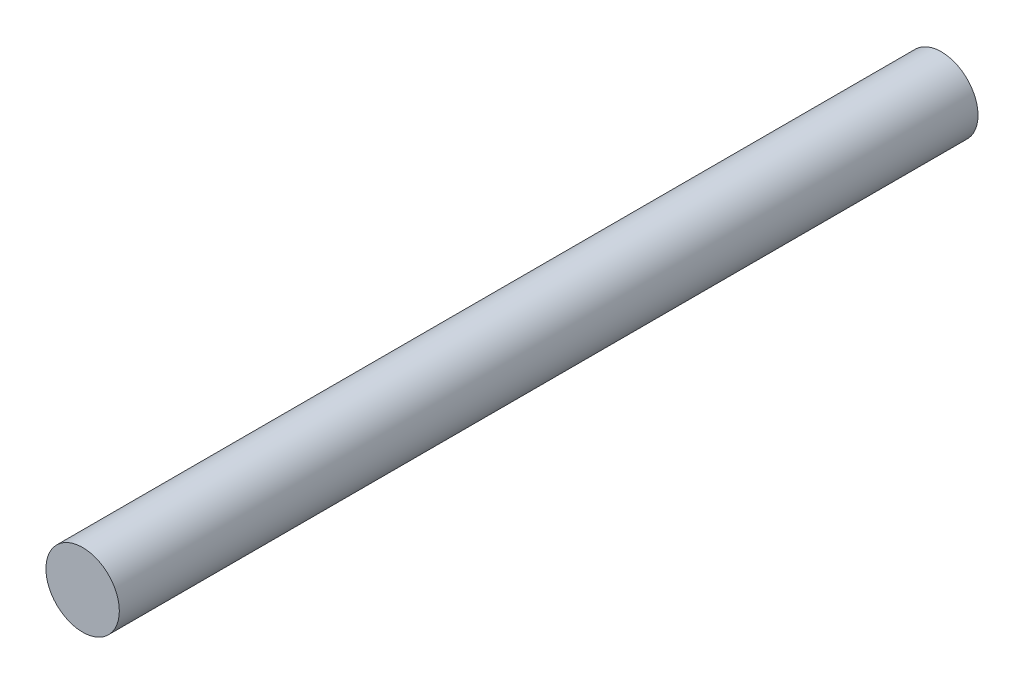
ISO-10303-21;
HEADER;
FILE_DESCRIPTION(('STEP AP214'),'2;1');
FILE_NAME('part.step','',(''),(''),'','','');
FILE_SCHEMA(('AUTOMOTIVE_DESIGN { 1 0 10303 214 1 1 1 1 }'));
ENDSEC;
DATA;
#1=APPLICATION_CONTEXT('core data for automotive mechanical design processes');
#2=APPLICATION_PROTOCOL_DEFINITION('international standard','automotive_design',2000,#1);
#3=PRODUCT_CONTEXT('',#1,'mechanical');
#4=PRODUCT('Part','Part','',(#3));
#5=PRODUCT_RELATED_PRODUCT_CATEGORY('part','',(#4));
#6=PRODUCT_DEFINITION_FORMATION('','',#4);
#7=PRODUCT_DEFINITION_CONTEXT('part definition',#1,'design');
#8=PRODUCT_DEFINITION('design','',#6,#7);
#9=PRODUCT_DEFINITION_SHAPE('','',#8);
#10=(LENGTH_UNIT() NAMED_UNIT(*) SI_UNIT(.MILLI.,.METRE.));
#11=(NAMED_UNIT(*) PLANE_ANGLE_UNIT() SI_UNIT($,.RADIAN.));
#12=(NAMED_UNIT(*) SI_UNIT($,.STERADIAN.) SOLID_ANGLE_UNIT());
#13=UNCERTAINTY_MEASURE_WITH_UNIT(LENGTH_MEASURE(1.E-05),#10,'distance_accuracy_value','');
#14=(GEOMETRIC_REPRESENTATION_CONTEXT(3) GLOBAL_UNCERTAINTY_ASSIGNED_CONTEXT((#13)) GLOBAL_UNIT_ASSIGNED_CONTEXT((#10,
#11,#12)) REPRESENTATION_CONTEXT('',''));
#15=CARTESIAN_POINT('',(0.,0.,0.));
#16=DIRECTION('',(0.,0.,1.));
#17=DIRECTION('',(1.,0.,0.));
#18=AXIS2_PLACEMENT_3D('',#15,#16,#17);
#19=CARTESIAN_POINT('',(0.,0.,46.8));
#20=DIRECTION('',(0.,0.,-1.));
#21=DIRECTION('',(-1.,0.,0.));
#22=AXIS2_PLACEMENT_3D('',#19,#20,#21);
#23=CYLINDRICAL_SURFACE('',#22,2.);
#24=CARTESIAN_POINT('',(0.,0.,46.8));
#25=DIRECTION('',(0.,0.,1.));
#26=DIRECTION('',(1.,0.,0.));
#27=AXIS2_PLACEMENT_3D('',#24,#25,#26);
#28=CIRCLE('',#27,2.);
#29=CARTESIAN_POINT('',(2.,0.,46.8));
#30=VERTEX_POINT('',#29);
#31=EDGE_CURVE('E10',#30,#30,#28,.T.);
#32=ORIENTED_EDGE('',*,*,#31,.F.);
#33=EDGE_LOOP('',(#32));
#34=FACE_BOUND('',#33,.T.);
#35=CARTESIAN_POINT('',(0.,0.,0.));
#36=DIRECTION('',(0.,0.,1.));
#37=DIRECTION('',(1.,0.,0.));
#38=AXIS2_PLACEMENT_3D('',#35,#36,#37);
#39=CIRCLE('',#38,2.);
#40=CARTESIAN_POINT('',(2.,0.,0.));
#41=VERTEX_POINT('',#40);
#42=EDGE_CURVE('E45',#41,#41,#39,.T.);
#43=ORIENTED_EDGE('',*,*,#42,.T.);
#44=EDGE_LOOP('',(#43));
#45=FACE_BOUND('',#44,.T.);
#46=ADVANCED_FACE('F39',(#34,#45),#23,.T.);
#47=CARTESIAN_POINT('',(0.,0.,46.8));
#48=DIRECTION('',(0.,0.,1.));
#49=DIRECTION('',(1.,0.,0.));
#50=AXIS2_PLACEMENT_3D('',#47,#48,#49);
#51=PLANE('',#50);
#52=ORIENTED_EDGE('',*,*,#31,.T.);
#53=EDGE_LOOP('',(#52));
#54=FACE_BOUND('',#53,.T.);
#55=ADVANCED_FACE('F53',(#54),#51,.T.);
#56=CARTESIAN_POINT('',(0.,0.,0.));
#57=DIRECTION('',(0.,0.,1.));
#58=DIRECTION('',(1.,0.,0.));
#59=AXIS2_PLACEMENT_3D('',#56,#57,#58);
#60=PLANE('',#59);
#61=ORIENTED_EDGE('',*,*,#42,.F.);
#62=EDGE_LOOP('',(#61));
#63=FACE_BOUND('',#62,.T.);
#64=ADVANCED_FACE('F55',(#63),#60,.F.);
#65=CLOSED_SHELL('',(#46,#55,#64));
#66=MANIFOLD_SOLID_BREP('B2',#65);
#67=ADVANCED_BREP_SHAPE_REPRESENTATION('',(#18,#66),#14);
#68=SHAPE_DEFINITION_REPRESENTATION(#9,#67);
ENDSEC;
END-ISO-10303-21;
